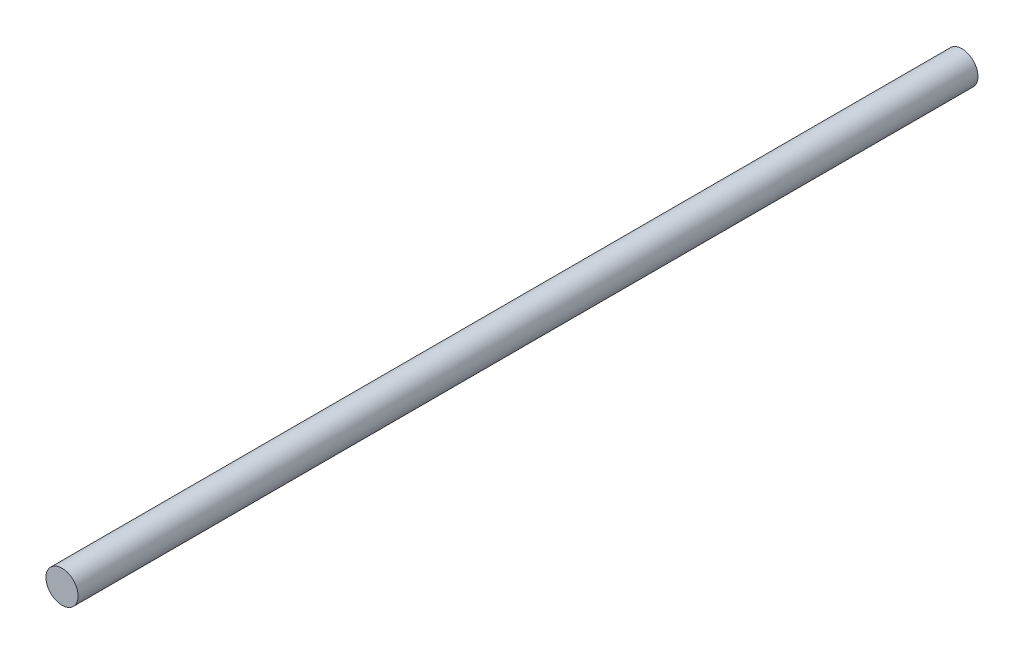
ISO-10303-21;
HEADER;
FILE_DESCRIPTION(('STEP AP214'),'2;1');
FILE_NAME('part.step','',(''),(''),'','','');
FILE_SCHEMA(('AUTOMOTIVE_DESIGN { 1 0 10303 214 1 1 1 1 }'));
ENDSEC;
DATA;
#1=APPLICATION_CONTEXT('core data for automotive mechanical design processes');
#2=APPLICATION_PROTOCOL_DEFINITION('international standard','automotive_design',2000,#1);
#3=PRODUCT_CONTEXT('',#1,'mechanical');
#4=PRODUCT('Part','Part','',(#3));
#5=PRODUCT_RELATED_PRODUCT_CATEGORY('part','',(#4));
#6=PRODUCT_DEFINITION_FORMATION('','',#4);
#7=PRODUCT_DEFINITION_CONTEXT('part definition',#1,'design');
#8=PRODUCT_DEFINITION('design','',#6,#7);
#9=PRODUCT_DEFINITION_SHAPE('','',#8);
#10=(LENGTH_UNIT() NAMED_UNIT(*) SI_UNIT(.MILLI.,.METRE.));
#11=(NAMED_UNIT(*) PLANE_ANGLE_UNIT() SI_UNIT($,.RADIAN.));
#12=(NAMED_UNIT(*) SI_UNIT($,.STERADIAN.) SOLID_ANGLE_UNIT());
#13=UNCERTAINTY_MEASURE_WITH_UNIT(LENGTH_MEASURE(1.E-05),#10,'distance_accuracy_value','');
#14=(GEOMETRIC_REPRESENTATION_CONTEXT(3) GLOBAL_UNCERTAINTY_ASSIGNED_CONTEXT((#13)) GLOBAL_UNIT_ASSIGNED_CONTEXT((#10,
#11,#12)) REPRESENTATION_CONTEXT('',''));
#15=CARTESIAN_POINT('',(0.,0.,0.));
#16=DIRECTION('',(0.,0.,1.));
#17=DIRECTION('',(1.,0.,0.));
#18=AXIS2_PLACEMENT_3D('',#15,#16,#17);
#19=CARTESIAN_POINT('',(0.,0.,280.));
#20=DIRECTION('',(0.,0.,-1.));
#21=DIRECTION('',(-1.,0.,0.));
#22=AXIS2_PLACEMENT_3D('',#19,#20,#21);
#23=CYLINDRICAL_SURFACE('',#22,5.);
#24=CARTESIAN_POINT('',(0.,0.,280.));
#25=DIRECTION('',(0.,0.,1.));
#26=DIRECTION('',(1.,0.,0.));
#27=AXIS2_PLACEMENT_3D('',#24,#25,#26);
#28=CIRCLE('',#27,5.);
#29=CARTESIAN_POINT('',(5.,0.,280.));
#30=VERTEX_POINT('',#29);
#31=EDGE_CURVE('E10',#30,#30,#28,.T.);
#32=ORIENTED_EDGE('',*,*,#31,.F.);
#33=EDGE_LOOP('',(#32));
#34=FACE_BOUND('',#33,.T.);
#35=CARTESIAN_POINT('',(0.,0.,0.));
#36=DIRECTION('',(0.,0.,1.));
#37=DIRECTION('',(1.,0.,0.));
#38=AXIS2_PLACEMENT_3D('',#35,#36,#37);
#39=CIRCLE('',#38,5.);
#40=CARTESIAN_POINT('',(5.,0.,0.));
#41=VERTEX_POINT('',#40);
#42=EDGE_CURVE('E40',#41,#41,#39,.T.);
#43=ORIENTED_EDGE('',*,*,#42,.T.);
#44=EDGE_LOOP('',(#43));
#45=FACE_BOUND('',#44,.T.);
#46=ADVANCED_FACE('F37',(#34,#45),#23,.T.);
#47=CARTESIAN_POINT('',(0.,0.,280.));
#48=DIRECTION('',(0.,0.,1.));
#49=DIRECTION('',(1.,0.,0.));
#50=AXIS2_PLACEMENT_3D('',#47,#48,#49);
#51=PLANE('',#50);
#52=ORIENTED_EDGE('',*,*,#31,.T.);
#53=EDGE_LOOP('',(#52));
#54=FACE_BOUND('',#53,.T.);
#55=ADVANCED_FACE('F52',(#54),#51,.T.);
#56=CARTESIAN_POINT('',(0.,0.,0.));
#57=DIRECTION('',(0.,0.,1.));
#58=DIRECTION('',(1.,0.,0.));
#59=AXIS2_PLACEMENT_3D('',#56,#57,#58);
#60=PLANE('',#59);
#61=ORIENTED_EDGE('',*,*,#42,.F.);
#62=EDGE_LOOP('',(#61));
#63=FACE_BOUND('',#62,.T.);
#64=ADVANCED_FACE('F50',(#63),#60,.F.);
#65=CLOSED_SHELL('',(#46,#55,#64));
#66=MANIFOLD_SOLID_BREP('B2',#65);
#67=ADVANCED_BREP_SHAPE_REPRESENTATION('',(#18,#66),#14);
#68=SHAPE_DEFINITION_REPRESENTATION(#9,#67);
ENDSEC;
END-ISO-10303-21;
